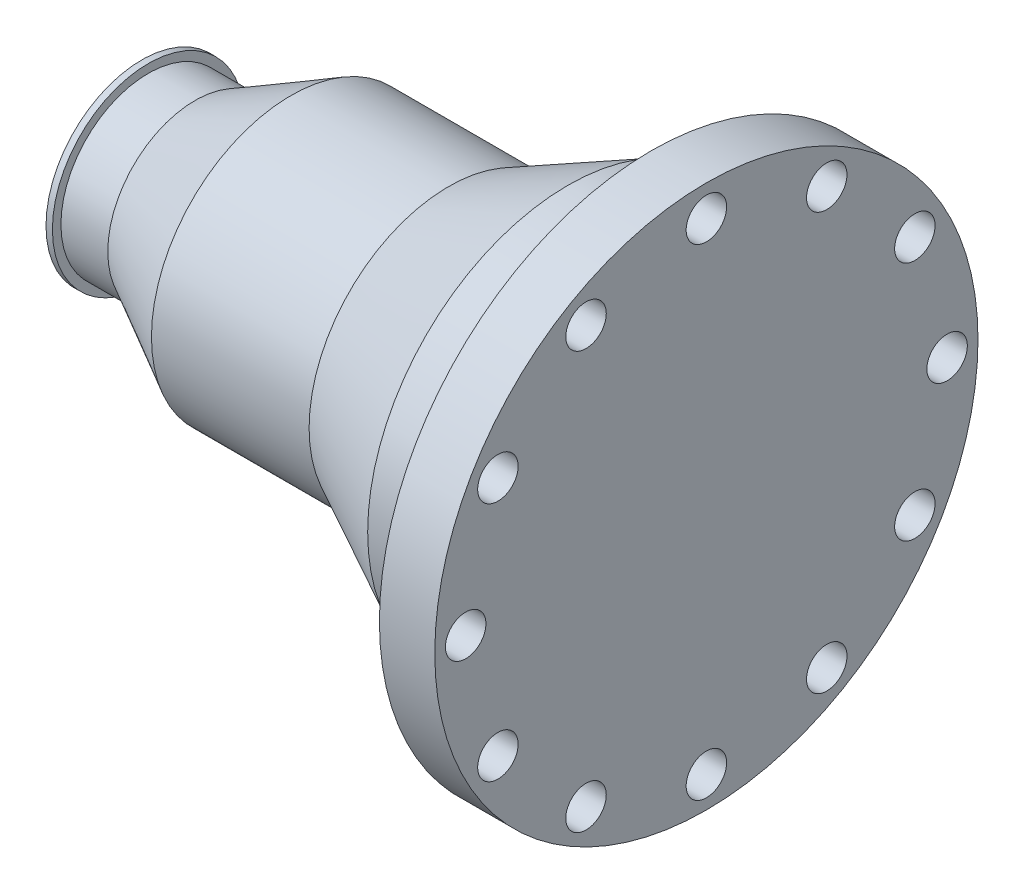
ISO-10303-21;
HEADER;
FILE_DESCRIPTION(('STEP AP214'),'2;1');
FILE_NAME('part.step','',(''),(''),'','','');
FILE_SCHEMA(('AUTOMOTIVE_DESIGN { 1 0 10303 214 1 1 1 1 }'));
ENDSEC;
DATA;
#1=APPLICATION_CONTEXT('core data for automotive mechanical design processes');
#2=APPLICATION_PROTOCOL_DEFINITION('international standard','automotive_design',2000,#1);
#3=PRODUCT_CONTEXT('',#1,'mechanical');
#4=PRODUCT('Part','Part','',(#3));
#5=PRODUCT_RELATED_PRODUCT_CATEGORY('part','',(#4));
#6=PRODUCT_DEFINITION_FORMATION('','',#4);
#7=PRODUCT_DEFINITION_CONTEXT('part definition',#1,'design');
#8=PRODUCT_DEFINITION('design','',#6,#7);
#9=PRODUCT_DEFINITION_SHAPE('','',#8);
#10=(LENGTH_UNIT() NAMED_UNIT(*) SI_UNIT(.MILLI.,.METRE.));
#11=(NAMED_UNIT(*) PLANE_ANGLE_UNIT() SI_UNIT($,.RADIAN.));
#12=(NAMED_UNIT(*) SI_UNIT($,.STERADIAN.) SOLID_ANGLE_UNIT());
#13=UNCERTAINTY_MEASURE_WITH_UNIT(LENGTH_MEASURE(1.E-05),#10,'distance_accuracy_value','');
#14=(GEOMETRIC_REPRESENTATION_CONTEXT(3) GLOBAL_UNCERTAINTY_ASSIGNED_CONTEXT((#13)) GLOBAL_UNIT_ASSIGNED_CONTEXT((#10,
#11,#12)) REPRESENTATION_CONTEXT('',''));
#15=CARTESIAN_POINT('',(0.,0.,0.));
#16=DIRECTION('',(0.,0.,1.));
#17=DIRECTION('',(1.,0.,0.));
#18=AXIS2_PLACEMENT_3D('',#15,#16,#17);
#19=CARTESIAN_POINT('',(0.,0.,0.));
#20=DIRECTION('',(1.,0.,0.));
#21=DIRECTION('',(0.,0.,-1.));
#22=AXIS2_PLACEMENT_3D('',#19,#20,#21);
#23=PLANE('',#22);
#24=CARTESIAN_POINT('',(0.,0.,0.));
#25=DIRECTION('',(-1.,0.,0.));
#26=DIRECTION('',(0.,0.,1.));
#27=AXIS2_PLACEMENT_3D('',#24,#25,#26);
#28=CIRCLE('',#27,31.);
#29=CARTESIAN_POINT('',(0.,0.,31.));
#30=VERTEX_POINT('',#29);
#31=EDGE_CURVE('E80',#30,#30,#28,.T.);
#32=ORIENTED_EDGE('',*,*,#31,.F.);
#33=EDGE_LOOP('',(#32));
#34=FACE_BOUND('',#33,.T.);
#35=CARTESIAN_POINT('',(0.,0.,0.));
#36=DIRECTION('',(-1.,0.,0.));
#37=DIRECTION('',(0.,0.,1.));
#38=AXIS2_PLACEMENT_3D('',#35,#36,#37);
#39=CIRCLE('',#38,45.);
#40=CARTESIAN_POINT('',(0.,0.,45.));
#41=VERTEX_POINT('',#40);
#42=EDGE_CURVE('E10',#41,#41,#39,.T.);
#43=ORIENTED_EDGE('',*,*,#42,.T.);
#44=EDGE_LOOP('',(#43));
#45=FACE_BOUND('',#44,.T.);
#46=ADVANCED_FACE('F37',(#34,#45),#23,.F.);
#47=CARTESIAN_POINT('',(0.,0.,0.));
#48=DIRECTION('',(-1.,0.,0.));
#49=DIRECTION('',(0.,0.,1.));
#50=AXIS2_PLACEMENT_3D('',#47,#48,#49);
#51=CYLINDRICAL_SURFACE('',#50,45.);
#52=ORIENTED_EDGE('',*,*,#42,.F.);
#53=EDGE_LOOP('',(#52));
#54=FACE_BOUND('',#53,.T.);
#55=CARTESIAN_POINT('',(3.,0.,0.));
#56=DIRECTION('',(-1.,0.,0.));
#57=DIRECTION('',(0.,0.,1.));
#58=AXIS2_PLACEMENT_3D('',#55,#56,#57);
#59=CIRCLE('',#58,45.);
#60=CARTESIAN_POINT('',(3.,0.,45.));
#61=VERTEX_POINT('',#60);
#62=EDGE_CURVE('E43',#61,#61,#59,.T.);
#63=ORIENTED_EDGE('',*,*,#62,.T.);
#64=EDGE_LOOP('',(#63));
#65=FACE_BOUND('',#64,.T.);
#66=ADVANCED_FACE('F235',(#54,#65),#51,.T.);
#67=CARTESIAN_POINT('',(3.,45.,0.));
#68=DIRECTION('',(-1.,0.,0.));
#69=DIRECTION('',(0.,0.,1.));
#70=AXIS2_PLACEMENT_3D('',#67,#68,#69);
#71=PLANE('',#70);
#72=ORIENTED_EDGE('',*,*,#62,.F.);
#73=EDGE_LOOP('',(#72));
#74=FACE_BOUND('',#73,.T.);
#75=CARTESIAN_POINT('',(3.,0.,0.));
#76=DIRECTION('',(-1.,0.,0.));
#77=DIRECTION('',(0.,0.,1.));
#78=AXIS2_PLACEMENT_3D('',#75,#76,#77);
#79=CIRCLE('',#78,41.);
#80=CARTESIAN_POINT('',(3.,0.,41.));
#81=VERTEX_POINT('',#80);
#82=EDGE_CURVE('E47',#81,#81,#79,.T.);
#83=ORIENTED_EDGE('',*,*,#82,.T.);
#84=EDGE_LOOP('',(#83));
#85=FACE_BOUND('',#84,.T.);
#86=ADVANCED_FACE('F241',(#74,#85),#71,.F.);
#87=CARTESIAN_POINT('',(0.,0.,0.));
#88=DIRECTION('',(-1.,0.,0.));
#89=DIRECTION('',(0.,0.,1.));
#90=AXIS2_PLACEMENT_3D('',#87,#88,#89);
#91=CYLINDRICAL_SURFACE('',#90,41.);
#92=ORIENTED_EDGE('',*,*,#82,.F.);
#93=EDGE_LOOP('',(#92));
#94=FACE_BOUND('',#93,.T.);
#95=CARTESIAN_POINT('',(25.,0.,0.));
#96=DIRECTION('',(-1.,0.,0.));
#97=DIRECTION('',(0.,0.,1.));
#98=AXIS2_PLACEMENT_3D('',#95,#96,#97);
#99=CIRCLE('',#98,41.);
#100=CARTESIAN_POINT('',(25.,0.,41.));
#101=VERTEX_POINT('',#100);
#102=EDGE_CURVE('E51',#101,#101,#99,.T.);
#103=ORIENTED_EDGE('',*,*,#102,.T.);
#104=EDGE_LOOP('',(#103));
#105=FACE_BOUND('',#104,.T.);
#106=ADVANCED_FACE('F559',(#94,#105),#91,.T.);
#107=CARTESIAN_POINT('',(70.,0.,0.));
#108=DIRECTION('',(1.,0.,0.));
#109=DIRECTION('',(0.,0.,-1.));
#110=AXIS2_PLACEMENT_3D('',#107,#108,#109);
#111=CONICAL_SURFACE('',#110,65.5,0.498567905638218);
#112=ORIENTED_EDGE('',*,*,#102,.F.);
#113=EDGE_LOOP('',(#112));
#114=FACE_BOUND('',#113,.T.);
#115=CARTESIAN_POINT('',(70.,0.,0.));
#116=DIRECTION('',(-1.,0.,0.));
#117=DIRECTION('',(0.,0.,1.));
#118=AXIS2_PLACEMENT_3D('',#115,#116,#117);
#119=CIRCLE('',#118,65.5);
#120=CARTESIAN_POINT('',(70.,0.,65.5));
#121=VERTEX_POINT('',#120);
#122=EDGE_CURVE('E56',#121,#121,#119,.T.);
#123=ORIENTED_EDGE('',*,*,#122,.T.);
#124=EDGE_LOOP('',(#123));
#125=FACE_BOUND('',#124,.T.);
#126=ADVANCED_FACE('F550',(#114,#125),#111,.T.);
#127=CARTESIAN_POINT('',(0.,0.,0.));
#128=DIRECTION('',(-1.,0.,0.));
#129=DIRECTION('',(0.,0.,1.));
#130=AXIS2_PLACEMENT_3D('',#127,#128,#129);
#131=CYLINDRICAL_SURFACE('',#130,65.5);
#132=ORIENTED_EDGE('',*,*,#122,.F.);
#133=EDGE_LOOP('',(#132));
#134=FACE_BOUND('',#133,.T.);
#135=CARTESIAN_POINT('',(144.,0.,0.));
#136=DIRECTION('',(-1.,0.,0.));
#137=DIRECTION('',(0.,0.,1.));
#138=AXIS2_PLACEMENT_3D('',#135,#136,#137);
#139=CIRCLE('',#138,65.5);
#140=CARTESIAN_POINT('',(144.,0.,65.5));
#141=VERTEX_POINT('',#140);
#142=EDGE_CURVE('E59',#141,#141,#139,.T.);
#143=ORIENTED_EDGE('',*,*,#142,.T.);
#144=EDGE_LOOP('',(#143));
#145=FACE_BOUND('',#144,.T.);
#146=ADVANCED_FACE('F541',(#134,#145),#131,.T.);
#147=CARTESIAN_POINT('',(200.,0.,0.));
#148=DIRECTION('',(1.,0.,0.));
#149=DIRECTION('',(0.,0.,-1.));
#150=AXIS2_PLACEMENT_3D('',#147,#148,#149);
#151=CONICAL_SURFACE('',#150,94.,0.470764926542016);
#152=ORIENTED_EDGE('',*,*,#142,.F.);
#153=EDGE_LOOP('',(#152));
#154=FACE_BOUND('',#153,.T.);
#155=CARTESIAN_POINT('',(200.,0.,0.));
#156=DIRECTION('',(-1.,0.,0.));
#157=DIRECTION('',(0.,0.,1.));
#158=AXIS2_PLACEMENT_3D('',#155,#156,#157);
#159=CIRCLE('',#158,94.);
#160=CARTESIAN_POINT('',(200.,0.,94.));
#161=VERTEX_POINT('',#160);
#162=EDGE_CURVE('E62',#161,#161,#159,.T.);
#163=ORIENTED_EDGE('',*,*,#162,.T.);
#164=EDGE_LOOP('',(#163));
#165=FACE_BOUND('',#164,.T.);
#166=ADVANCED_FACE('F532',(#154,#165),#151,.T.);
#167=CARTESIAN_POINT('',(0.,0.,0.));
#168=DIRECTION('',(-1.,0.,0.));
#169=DIRECTION('',(0.,0.,1.));
#170=AXIS2_PLACEMENT_3D('',#167,#168,#169);
#171=CYLINDRICAL_SURFACE('',#170,94.);
#172=ORIENTED_EDGE('',*,*,#162,.F.);
#173=EDGE_LOOP('',(#172));
#174=FACE_BOUND('',#173,.T.);
#175=CARTESIAN_POINT('',(220.,0.,0.));
#176=DIRECTION('',(-1.,0.,0.));
#177=DIRECTION('',(0.,0.,1.));
#178=AXIS2_PLACEMENT_3D('',#175,#176,#177);
#179=CIRCLE('',#178,94.);
#180=CARTESIAN_POINT('',(220.,0.,94.));
#181=VERTEX_POINT('',#180);
#182=EDGE_CURVE('E65',#181,#181,#179,.T.);
#183=ORIENTED_EDGE('',*,*,#182,.T.);
#184=EDGE_LOOP('',(#183));
#185=FACE_BOUND('',#184,.T.);
#186=ADVANCED_FACE('F523',(#174,#185),#171,.T.);
#187=CARTESIAN_POINT('',(220.,94.,0.));
#188=DIRECTION('',(1.,0.,0.));
#189=DIRECTION('',(0.,0.,-1.));
#190=AXIS2_PLACEMENT_3D('',#187,#188,#189);
#191=PLANE('',#190);
#192=ORIENTED_EDGE('',*,*,#182,.F.);
#193=EDGE_LOOP('',(#192));
#194=FACE_BOUND('',#193,.T.);
#195=CARTESIAN_POINT('',(220.,0.,0.));
#196=DIRECTION('',(-1.,0.,0.));
#197=DIRECTION('',(0.,0.,1.));
#198=AXIS2_PLACEMENT_3D('',#195,#196,#197);
#199=CIRCLE('',#198,95.);
#200=CARTESIAN_POINT('',(220.,0.,95.));
#201=VERTEX_POINT('',#200);
#202=EDGE_CURVE('E68',#201,#201,#199,.T.);
#203=ORIENTED_EDGE('',*,*,#202,.T.);
#204=EDGE_LOOP('',(#203));
#205=FACE_BOUND('',#204,.T.);
#206=ADVANCED_FACE('F514',(#194,#205),#191,.F.);
#207=CARTESIAN_POINT('',(0.,0.,0.));
#208=DIRECTION('',(-1.,0.,0.));
#209=DIRECTION('',(0.,0.,1.));
#210=AXIS2_PLACEMENT_3D('',#207,#208,#209);
#211=CYLINDRICAL_SURFACE('',#210,95.);
#212=ORIENTED_EDGE('',*,*,#202,.F.);
#213=EDGE_LOOP('',(#212));
#214=FACE_BOUND('',#213,.T.);
#215=CARTESIAN_POINT('',(239.,0.,0.));
#216=DIRECTION('',(-1.,0.,0.));
#217=DIRECTION('',(0.,0.,1.));
#218=AXIS2_PLACEMENT_3D('',#215,#216,#217);
#219=CIRCLE('',#218,95.);
#220=CARTESIAN_POINT('',(239.,0.,95.));
#221=VERTEX_POINT('',#220);
#222=EDGE_CURVE('E71',#221,#221,#219,.T.);
#223=ORIENTED_EDGE('',*,*,#222,.T.);
#224=EDGE_LOOP('',(#223));
#225=FACE_BOUND('',#224,.T.);
#226=ADVANCED_FACE('F231',(#214,#225),#211,.T.);
#227=CARTESIAN_POINT('',(239.,100.,0.));
#228=DIRECTION('',(1.,0.,0.));
#229=DIRECTION('',(0.,0.,-1.));
#230=AXIS2_PLACEMENT_3D('',#227,#228,#229);
#231=PLANE('',#230);
#232=CARTESIAN_POINT('',(239.,97.8608706276416,-56.5));
#233=DIRECTION('',(1.,0.,0.));
#234=DIRECTION('',(0.,0.,-1.));
#235=AXIS2_PLACEMENT_3D('',#232,#233,#234);
#236=CIRCLE('',#235,9.50000000000001);
#237=CARTESIAN_POINT('',(239.,97.8608706276416,-66.));
#238=VERTEX_POINT('',#237);
#239=EDGE_CURVE('E182',#238,#238,#236,.F.);
#240=ORIENTED_EDGE('',*,*,#239,.F.);
#241=EDGE_LOOP('',(#240));
#242=FACE_BOUND('',#241,.T.);
#243=CARTESIAN_POINT('',(239.,56.4999999999999,-97.8608706276416));
#244=DIRECTION('',(1.,0.,0.));
#245=DIRECTION('',(0.,0.,-1.));
#246=AXIS2_PLACEMENT_3D('',#243,#244,#245);
#247=CIRCLE('',#246,9.5);
#248=CARTESIAN_POINT('',(239.,56.4999999999999,-107.360870627642));
#249=VERTEX_POINT('',#248);
#250=EDGE_CURVE('E176',#249,#249,#247,.F.);
#251=ORIENTED_EDGE('',*,*,#250,.F.);
#252=EDGE_LOOP('',(#251));
#253=FACE_BOUND('',#252,.T.);
#254=CARTESIAN_POINT('',(239.,0.,-113.));
#255=DIRECTION('',(1.,0.,0.));
#256=DIRECTION('',(0.,0.,-1.));
#257=AXIS2_PLACEMENT_3D('',#254,#255,#256);
#258=CIRCLE('',#257,9.49999999999999);
#259=CARTESIAN_POINT('',(239.,0.,-122.5));
#260=VERTEX_POINT('',#259);
#261=EDGE_CURVE('E170',#260,#260,#258,.F.);
#262=ORIENTED_EDGE('',*,*,#261,.F.);
#263=EDGE_LOOP('',(#262));
#264=FACE_BOUND('',#263,.T.);
#265=CARTESIAN_POINT('',(239.,-56.5,-97.8608706276415));
#266=DIRECTION('',(1.,0.,0.));
#267=DIRECTION('',(0.,0.,-1.));
#268=AXIS2_PLACEMENT_3D('',#265,#266,#267);
#269=CIRCLE('',#268,9.5);
#270=CARTESIAN_POINT('',(239.,-56.5,-107.360870627642));
#271=VERTEX_POINT('',#270);
#272=EDGE_CURVE('E164',#271,#271,#269,.F.);
#273=ORIENTED_EDGE('',*,*,#272,.F.);
#274=EDGE_LOOP('',(#273));
#275=FACE_BOUND('',#274,.T.);
#276=CARTESIAN_POINT('',(239.,-97.8608706276416,-56.5));
#277=DIRECTION('',(1.,0.,0.));
#278=DIRECTION('',(0.,0.,-1.));
#279=AXIS2_PLACEMENT_3D('',#276,#277,#278);
#280=CIRCLE('',#279,9.50000000000001);
#281=CARTESIAN_POINT('',(239.,-97.8608706276416,-66.));
#282=VERTEX_POINT('',#281);
#283=EDGE_CURVE('E158',#282,#282,#280,.F.);
#284=ORIENTED_EDGE('',*,*,#283,.F.);
#285=EDGE_LOOP('',(#284));
#286=FACE_BOUND('',#285,.T.);
#287=CARTESIAN_POINT('',(239.,-113.,0.));
#288=DIRECTION('',(1.,0.,0.));
#289=DIRECTION('',(0.,0.,-1.));
#290=AXIS2_PLACEMENT_3D('',#287,#288,#289);
#291=CIRCLE('',#290,9.49999999999998);
#292=CARTESIAN_POINT('',(239.,-113.,-9.49999999999998));
#293=VERTEX_POINT('',#292);
#294=EDGE_CURVE('E152',#293,#293,#291,.F.);
#295=ORIENTED_EDGE('',*,*,#294,.F.);
#296=EDGE_LOOP('',(#295));
#297=FACE_BOUND('',#296,.T.);
#298=CARTESIAN_POINT('',(239.,-97.8608706276415,56.5));
#299=DIRECTION('',(1.,0.,0.));
#300=DIRECTION('',(0.,0.,-1.));
#301=AXIS2_PLACEMENT_3D('',#298,#299,#300);
#302=CIRCLE('',#301,9.5);
#303=CARTESIAN_POINT('',(239.,-97.8608706276415,47.));
#304=VERTEX_POINT('',#303);
#305=EDGE_CURVE('E146',#304,#304,#302,.F.);
#306=ORIENTED_EDGE('',*,*,#305,.F.);
#307=EDGE_LOOP('',(#306));
#308=FACE_BOUND('',#307,.T.);
#309=CARTESIAN_POINT('',(239.,-56.5,97.8608706276416));
#310=DIRECTION('',(1.,0.,0.));
#311=DIRECTION('',(0.,0.,-1.));
#312=AXIS2_PLACEMENT_3D('',#309,#310,#311);
#313=CIRCLE('',#312,9.5);
#314=CARTESIAN_POINT('',(239.,-56.5,88.3608706276416));
#315=VERTEX_POINT('',#314);
#316=EDGE_CURVE('E140',#315,#315,#313,.F.);
#317=ORIENTED_EDGE('',*,*,#316,.F.);
#318=EDGE_LOOP('',(#317));
#319=FACE_BOUND('',#318,.T.);
#320=CARTESIAN_POINT('',(239.,0.,113.));
#321=DIRECTION('',(1.,0.,0.));
#322=DIRECTION('',(0.,0.,-1.));
#323=AXIS2_PLACEMENT_3D('',#320,#321,#322);
#324=CIRCLE('',#323,9.49999999999999);
#325=CARTESIAN_POINT('',(239.,0.,103.5));
#326=VERTEX_POINT('',#325);
#327=EDGE_CURVE('E134',#326,#326,#324,.F.);
#328=ORIENTED_EDGE('',*,*,#327,.F.);
#329=EDGE_LOOP('',(#328));
#330=FACE_BOUND('',#329,.T.);
#331=CARTESIAN_POINT('',(239.,56.5,97.8608706276416));
#332=DIRECTION('',(1.,0.,0.));
#333=DIRECTION('',(0.,0.,-1.));
#334=AXIS2_PLACEMENT_3D('',#331,#332,#333);
#335=CIRCLE('',#334,9.5);
#336=CARTESIAN_POINT('',(239.,56.5,88.3608706276416));
#337=VERTEX_POINT('',#336);
#338=EDGE_CURVE('E128',#337,#337,#335,.F.);
#339=ORIENTED_EDGE('',*,*,#338,.F.);
#340=EDGE_LOOP('',(#339));
#341=FACE_BOUND('',#340,.T.);
#342=CARTESIAN_POINT('',(239.,97.8608706276416,56.5));
#343=DIRECTION('',(1.,0.,0.));
#344=DIRECTION('',(0.,0.,-1.));
#345=AXIS2_PLACEMENT_3D('',#342,#343,#344);
#346=CIRCLE('',#345,9.5);
#347=CARTESIAN_POINT('',(239.,97.8608706276416,47.));
#348=VERTEX_POINT('',#347);
#349=EDGE_CURVE('E122',#348,#348,#346,.F.);
#350=ORIENTED_EDGE('',*,*,#349,.F.);
#351=EDGE_LOOP('',(#350));
#352=FACE_BOUND('',#351,.T.);
#353=CARTESIAN_POINT('',(239.,113.,0.));
#354=DIRECTION('',(1.,0.,0.));
#355=DIRECTION('',(0.,0.,-1.));
#356=AXIS2_PLACEMENT_3D('',#353,#354,#355);
#357=CIRCLE('',#356,9.50000000000001);
#358=CARTESIAN_POINT('',(239.,113.,-9.50000000000001));
#359=VERTEX_POINT('',#358);
#360=EDGE_CURVE('E116',#359,#359,#357,.F.);
#361=ORIENTED_EDGE('',*,*,#360,.F.);
#362=EDGE_LOOP('',(#361));
#363=FACE_BOUND('',#362,.T.);
#364=ORIENTED_EDGE('',*,*,#222,.F.);
#365=EDGE_LOOP('',(#364));
#366=FACE_BOUND('',#365,.T.);
#367=CARTESIAN_POINT('',(239.,0.,0.));
#368=DIRECTION('',(-1.,0.,0.));
#369=DIRECTION('',(0.,0.,1.));
#370=AXIS2_PLACEMENT_3D('',#367,#368,#369);
#371=CIRCLE('',#370,127.5);
#372=CARTESIAN_POINT('',(239.,0.,127.5));
#373=VERTEX_POINT('',#372);
#374=EDGE_CURVE('E74',#373,#373,#371,.T.);
#375=ORIENTED_EDGE('',*,*,#374,.T.);
#376=EDGE_LOOP('',(#375));
#377=FACE_BOUND('',#376,.T.);
#378=ADVANCED_FACE('F223',(#242,#253,#264,#275,#286,#297,#308,#319,#330,#341,#352,#363,#366,
#377),#231,.F.);
#379=CARTESIAN_POINT('',(0.,0.,0.));
#380=DIRECTION('',(-1.,0.,0.));
#381=DIRECTION('',(0.,0.,1.));
#382=AXIS2_PLACEMENT_3D('',#379,#380,#381);
#383=CYLINDRICAL_SURFACE('',#382,127.5);
#384=ORIENTED_EDGE('',*,*,#374,.F.);
#385=EDGE_LOOP('',(#384));
#386=FACE_BOUND('',#385,.T.);
#387=CARTESIAN_POINT('',(265.,0.,0.));
#388=DIRECTION('',(-1.,0.,0.));
#389=DIRECTION('',(0.,0.,1.));
#390=AXIS2_PLACEMENT_3D('',#387,#388,#389);
#391=CIRCLE('',#390,127.5);
#392=CARTESIAN_POINT('',(265.,0.,127.5));
#393=VERTEX_POINT('',#392);
#394=EDGE_CURVE('E77',#393,#393,#391,.T.);
#395=ORIENTED_EDGE('',*,*,#394,.T.);
#396=EDGE_LOOP('',(#395));
#397=FACE_BOUND('',#396,.T.);
#398=ADVANCED_FACE('F196',(#386,#397),#383,.T.);
#399=CARTESIAN_POINT('',(265.,127.5,0.));
#400=DIRECTION('',(-1.,0.,0.));
#401=DIRECTION('',(0.,0.,1.));
#402=AXIS2_PLACEMENT_3D('',#399,#400,#401);
#403=PLANE('',#402);
#404=CARTESIAN_POINT('',(265.,97.8608706276416,-56.5));
#405=DIRECTION('',(1.,0.,0.));
#406=DIRECTION('',(0.,0.,-1.));
#407=AXIS2_PLACEMENT_3D('',#404,#405,#406);
#408=CIRCLE('',#407,9.50000000000001);
#409=CARTESIAN_POINT('',(265.,97.8608706276416,-66.));
#410=VERTEX_POINT('',#409);
#411=EDGE_CURVE('E185',#410,#410,#408,.T.);
#412=ORIENTED_EDGE('',*,*,#411,.F.);
#413=EDGE_LOOP('',(#412));
#414=FACE_BOUND('',#413,.T.);
#415=CARTESIAN_POINT('',(265.,56.4999999999999,-97.8608706276416));
#416=DIRECTION('',(1.,0.,0.));
#417=DIRECTION('',(0.,0.,-1.));
#418=AXIS2_PLACEMENT_3D('',#415,#416,#417);
#419=CIRCLE('',#418,9.5);
#420=CARTESIAN_POINT('',(265.,56.4999999999999,-107.360870627642));
#421=VERTEX_POINT('',#420);
#422=EDGE_CURVE('E179',#421,#421,#419,.T.);
#423=ORIENTED_EDGE('',*,*,#422,.F.);
#424=EDGE_LOOP('',(#423));
#425=FACE_BOUND('',#424,.T.);
#426=CARTESIAN_POINT('',(265.,0.,-113.));
#427=DIRECTION('',(1.,0.,0.));
#428=DIRECTION('',(0.,0.,-1.));
#429=AXIS2_PLACEMENT_3D('',#426,#427,#428);
#430=CIRCLE('',#429,9.49999999999999);
#431=CARTESIAN_POINT('',(265.,0.,-122.5));
#432=VERTEX_POINT('',#431);
#433=EDGE_CURVE('E173',#432,#432,#430,.T.);
#434=ORIENTED_EDGE('',*,*,#433,.F.);
#435=EDGE_LOOP('',(#434));
#436=FACE_BOUND('',#435,.T.);
#437=CARTESIAN_POINT('',(265.,-56.5,-97.8608706276415));
#438=DIRECTION('',(1.,0.,0.));
#439=DIRECTION('',(0.,0.,-1.));
#440=AXIS2_PLACEMENT_3D('',#437,#438,#439);
#441=CIRCLE('',#440,9.5);
#442=CARTESIAN_POINT('',(265.,-56.5,-107.360870627642));
#443=VERTEX_POINT('',#442);
#444=EDGE_CURVE('E167',#443,#443,#441,.T.);
#445=ORIENTED_EDGE('',*,*,#444,.F.);
#446=EDGE_LOOP('',(#445));
#447=FACE_BOUND('',#446,.T.);
#448=CARTESIAN_POINT('',(265.,-97.8608706276416,-56.5));
#449=DIRECTION('',(1.,0.,0.));
#450=DIRECTION('',(0.,0.,-1.));
#451=AXIS2_PLACEMENT_3D('',#448,#449,#450);
#452=CIRCLE('',#451,9.50000000000001);
#453=CARTESIAN_POINT('',(265.,-97.8608706276416,-66.));
#454=VERTEX_POINT('',#453);
#455=EDGE_CURVE('E161',#454,#454,#452,.T.);
#456=ORIENTED_EDGE('',*,*,#455,.F.);
#457=EDGE_LOOP('',(#456));
#458=FACE_BOUND('',#457,.T.);
#459=CARTESIAN_POINT('',(265.,-113.,0.));
#460=DIRECTION('',(1.,0.,0.));
#461=DIRECTION('',(0.,0.,-1.));
#462=AXIS2_PLACEMENT_3D('',#459,#460,#461);
#463=CIRCLE('',#462,9.49999999999998);
#464=CARTESIAN_POINT('',(265.,-113.,-9.49999999999998));
#465=VERTEX_POINT('',#464);
#466=EDGE_CURVE('E155',#465,#465,#463,.T.);
#467=ORIENTED_EDGE('',*,*,#466,.F.);
#468=EDGE_LOOP('',(#467));
#469=FACE_BOUND('',#468,.T.);
#470=CARTESIAN_POINT('',(265.,-97.8608706276415,56.5));
#471=DIRECTION('',(1.,0.,0.));
#472=DIRECTION('',(0.,0.,-1.));
#473=AXIS2_PLACEMENT_3D('',#470,#471,#472);
#474=CIRCLE('',#473,9.5);
#475=CARTESIAN_POINT('',(265.,-97.8608706276415,47.));
#476=VERTEX_POINT('',#475);
#477=EDGE_CURVE('E149',#476,#476,#474,.T.);
#478=ORIENTED_EDGE('',*,*,#477,.F.);
#479=EDGE_LOOP('',(#478));
#480=FACE_BOUND('',#479,.T.);
#481=CARTESIAN_POINT('',(265.,-56.5,97.8608706276416));
#482=DIRECTION('',(1.,0.,0.));
#483=DIRECTION('',(0.,0.,-1.));
#484=AXIS2_PLACEMENT_3D('',#481,#482,#483);
#485=CIRCLE('',#484,9.5);
#486=CARTESIAN_POINT('',(265.,-56.5,88.3608706276416));
#487=VERTEX_POINT('',#486);
#488=EDGE_CURVE('E143',#487,#487,#485,.T.);
#489=ORIENTED_EDGE('',*,*,#488,.F.);
#490=EDGE_LOOP('',(#489));
#491=FACE_BOUND('',#490,.T.);
#492=CARTESIAN_POINT('',(265.,0.,113.));
#493=DIRECTION('',(1.,0.,0.));
#494=DIRECTION('',(0.,0.,-1.));
#495=AXIS2_PLACEMENT_3D('',#492,#493,#494);
#496=CIRCLE('',#495,9.49999999999999);
#497=CARTESIAN_POINT('',(265.,0.,103.5));
#498=VERTEX_POINT('',#497);
#499=EDGE_CURVE('E137',#498,#498,#496,.T.);
#500=ORIENTED_EDGE('',*,*,#499,.F.);
#501=EDGE_LOOP('',(#500));
#502=FACE_BOUND('',#501,.T.);
#503=CARTESIAN_POINT('',(265.,56.5,97.8608706276416));
#504=DIRECTION('',(1.,0.,0.));
#505=DIRECTION('',(0.,0.,-1.));
#506=AXIS2_PLACEMENT_3D('',#503,#504,#505);
#507=CIRCLE('',#506,9.5);
#508=CARTESIAN_POINT('',(265.,56.5,88.3608706276416));
#509=VERTEX_POINT('',#508);
#510=EDGE_CURVE('E131',#509,#509,#507,.T.);
#511=ORIENTED_EDGE('',*,*,#510,.F.);
#512=EDGE_LOOP('',(#511));
#513=FACE_BOUND('',#512,.T.);
#514=CARTESIAN_POINT('',(265.,97.8608706276416,56.5));
#515=DIRECTION('',(1.,0.,0.));
#516=DIRECTION('',(0.,0.,-1.));
#517=AXIS2_PLACEMENT_3D('',#514,#515,#516);
#518=CIRCLE('',#517,9.5);
#519=CARTESIAN_POINT('',(265.,97.8608706276416,47.));
#520=VERTEX_POINT('',#519);
#521=EDGE_CURVE('E125',#520,#520,#518,.T.);
#522=ORIENTED_EDGE('',*,*,#521,.F.);
#523=EDGE_LOOP('',(#522));
#524=FACE_BOUND('',#523,.T.);
#525=CARTESIAN_POINT('',(265.,113.,0.));
#526=DIRECTION('',(1.,0.,0.));
#527=DIRECTION('',(0.,0.,-1.));
#528=AXIS2_PLACEMENT_3D('',#525,#526,#527);
#529=CIRCLE('',#528,9.50000000000001);
#530=CARTESIAN_POINT('',(265.,113.,-9.50000000000001));
#531=VERTEX_POINT('',#530);
#532=EDGE_CURVE('E119',#531,#531,#529,.T.);
#533=ORIENTED_EDGE('',*,*,#532,.F.);
#534=EDGE_LOOP('',(#533));
#535=FACE_BOUND('',#534,.T.);
#536=ORIENTED_EDGE('',*,*,#394,.F.);
#537=EDGE_LOOP('',(#536));
#538=FACE_BOUND('',#537,.T.);
#539=ADVANCED_FACE('F192',(#414,#425,#436,#447,#458,#469,#480,#491,#502,#513,#524,#535,#538),
#403,.F.);
#540=CARTESIAN_POINT('',(0.,0.,0.));
#541=DIRECTION('',(-1.,0.,0.));
#542=DIRECTION('',(0.,0.,1.));
#543=AXIS2_PLACEMENT_3D('',#540,#541,#542);
#544=CYLINDRICAL_SURFACE('',#543,31.);
#545=ORIENTED_EDGE('',*,*,#31,.T.);
#546=EDGE_LOOP('',(#545));
#547=FACE_BOUND('',#546,.T.);
#548=CARTESIAN_POINT('',(42.,0.,0.));
#549=DIRECTION('',(-1.,0.,0.));
#550=DIRECTION('',(0.,0.,1.));
#551=AXIS2_PLACEMENT_3D('',#548,#549,#550);
#552=CIRCLE('',#551,31.);
#553=CARTESIAN_POINT('',(42.,0.,31.));
#554=VERTEX_POINT('',#553);
#555=EDGE_CURVE('E83',#554,#554,#552,.T.);
#556=ORIENTED_EDGE('',*,*,#555,.F.);
#557=EDGE_LOOP('',(#556));
#558=FACE_BOUND('',#557,.T.);
#559=ADVANCED_FACE('F195',(#547,#558),#544,.F.);
#560=CARTESIAN_POINT('',(70.,0.,0.));
#561=DIRECTION('',(1.,0.,0.));
#562=DIRECTION('',(0.,0.,-1.));
#563=AXIS2_PLACEMENT_3D('',#560,#561,#562);
#564=CONICAL_SURFACE('',#563,38.502577,0.261799374867879);
#565=ORIENTED_EDGE('',*,*,#555,.T.);
#566=EDGE_LOOP('',(#565));
#567=FACE_BOUND('',#566,.T.);
#568=CARTESIAN_POINT('',(70.,0.,0.));
#569=DIRECTION('',(-1.,0.,0.));
#570=DIRECTION('',(0.,0.,1.));
#571=AXIS2_PLACEMENT_3D('',#568,#569,#570);
#572=CIRCLE('',#571,38.502577);
#573=CARTESIAN_POINT('',(70.,0.,38.502577));
#574=VERTEX_POINT('',#573);
#575=EDGE_CURVE('E86',#574,#574,#572,.T.);
#576=ORIENTED_EDGE('',*,*,#575,.F.);
#577=EDGE_LOOP('',(#576));
#578=FACE_BOUND('',#577,.T.);
#579=ADVANCED_FACE('F246',(#567,#578),#564,.F.);
#580=CARTESIAN_POINT('',(107.802202951022,0.,0.));
#581=DIRECTION('',(-1.,0.,0.));
#582=DIRECTION('',(0.,0.,1.));
#583=AXIS2_PLACEMENT_3D('',#580,#581,#582);
#584=DEGENERATE_TOROIDAL_SURFACE('',#583,5.77654352226822,49.9999981513586,.T.);
#585=ORIENTED_EDGE('',*,*,#575,.T.);
#586=EDGE_LOOP('',(#585));
#587=FACE_BOUND('',#586,.T.);
#588=CARTESIAN_POINT('',(90.,0.,0.));
#589=DIRECTION('',(-1.,0.,0.));
#590=DIRECTION('',(0.,0.,1.));
#591=AXIS2_PLACEMENT_3D('',#588,#589,#590);
#592=CIRCLE('',#591,52.5);
#593=CARTESIAN_POINT('',(90.,0.,52.5));
#594=VERTEX_POINT('',#593);
#595=EDGE_CURVE('E89',#594,#594,#592,.T.);
#596=ORIENTED_EDGE('',*,*,#595,.F.);
#597=EDGE_LOOP('',(#596));
#598=FACE_BOUND('',#597,.T.);
#599=ADVANCED_FACE('F252',(#587,#598),#584,.F.);
#600=CARTESIAN_POINT('',(0.,0.,0.));
#601=DIRECTION('',(-1.,0.,0.));
#602=DIRECTION('',(0.,0.,1.));
#603=AXIS2_PLACEMENT_3D('',#600,#601,#602);
#604=CYLINDRICAL_SURFACE('',#603,52.5);
#605=ORIENTED_EDGE('',*,*,#595,.T.);
#606=EDGE_LOOP('',(#605));
#607=FACE_BOUND('',#606,.T.);
#608=CARTESIAN_POINT('',(142.,0.,0.));
#609=DIRECTION('',(-1.,0.,0.));
#610=DIRECTION('',(0.,0.,1.));
#611=AXIS2_PLACEMENT_3D('',#608,#609,#610);
#612=CIRCLE('',#611,52.5);
#613=CARTESIAN_POINT('',(142.,0.,52.5));
#614=VERTEX_POINT('',#613);
#615=EDGE_CURVE('E92',#614,#614,#612,.T.);
#616=ORIENTED_EDGE('',*,*,#615,.F.);
#617=EDGE_LOOP('',(#616));
#618=FACE_BOUND('',#617,.T.);
#619=ADVANCED_FACE('F258',(#607,#618),#604,.F.);
#620=CARTESIAN_POINT('',(142.75,0.,0.));
#621=DIRECTION('',(-1.,0.,0.));
#622=DIRECTION('',(0.,0.,1.));
#623=AXIS2_PLACEMENT_3D('',#620,#621,#622);
#624=TOROIDAL_SURFACE('',#623,49.8031848031275,2.79916276877255);
#625=ORIENTED_EDGE('',*,*,#615,.T.);
#626=EDGE_LOOP('',(#625));
#627=FACE_BOUND('',#626,.T.);
#628=CARTESIAN_POINT('',(143.5,0.,0.));
#629=DIRECTION('',(-1.,0.,0.));
#630=DIRECTION('',(0.,0.,1.));
#631=AXIS2_PLACEMENT_3D('',#628,#629,#630);
#632=CIRCLE('',#631,52.5);
#633=CARTESIAN_POINT('',(143.5,0.,52.5));
#634=VERTEX_POINT('',#633);
#635=EDGE_CURVE('E95',#634,#634,#632,.T.);
#636=ORIENTED_EDGE('',*,*,#635,.F.);
#637=EDGE_LOOP('',(#636));
#638=FACE_BOUND('',#637,.T.);
#639=ADVANCED_FACE('F264',(#627,#638),#624,.F.);
#640=CARTESIAN_POINT('',(0.,0.,0.));
#641=DIRECTION('',(-1.,0.,0.));
#642=DIRECTION('',(0.,0.,1.));
#643=AXIS2_PLACEMENT_3D('',#640,#641,#642);
#644=CYLINDRICAL_SURFACE('',#643,52.5);
#645=ORIENTED_EDGE('',*,*,#635,.T.);
#646=EDGE_LOOP('',(#645));
#647=FACE_BOUND('',#646,.T.);
#648=CARTESIAN_POINT('',(146.669872,0.,0.));
#649=DIRECTION('',(-1.,0.,0.));
#650=DIRECTION('',(0.,0.,1.));
#651=AXIS2_PLACEMENT_3D('',#648,#649,#650);
#652=CIRCLE('',#651,52.5);
#653=CARTESIAN_POINT('',(146.669872,0.,52.5));
#654=VERTEX_POINT('',#653);
#655=EDGE_CURVE('E98',#654,#654,#652,.T.);
#656=ORIENTED_EDGE('',*,*,#655,.F.);
#657=EDGE_LOOP('',(#656));
#658=FACE_BOUND('',#657,.T.);
#659=ADVANCED_FACE('F270',(#647,#658),#644,.F.);
#660=CARTESIAN_POINT('',(147.593438045,0.,0.));
#661=DIRECTION('',(-1.,0.,0.));
#662=DIRECTION('',(0.,0.,1.));
#663=AXIS2_PLACEMENT_3D('',#660,#661,#662);
#664=TOROIDAL_SURFACE('',#663,53.580573582,1.42148285448445);
#665=ORIENTED_EDGE('',*,*,#655,.T.);
#666=EDGE_LOOP('',(#665));
#667=FACE_BOUND('',#666,.T.);
#668=CARTESIAN_POINT('',(147.669872,0.,0.));
#669=DIRECTION('',(-1.,0.,0.));
#670=DIRECTION('',(0.,0.,1.));
#671=AXIS2_PLACEMENT_3D('',#668,#669,#670);
#672=CIRCLE('',#671,55.);
#673=CARTESIAN_POINT('',(147.669872,0.,55.));
#674=VERTEX_POINT('',#673);
#675=EDGE_CURVE('E101',#674,#674,#672,.T.);
#676=ORIENTED_EDGE('',*,*,#675,.F.);
#677=EDGE_LOOP('',(#676));
#678=FACE_BOUND('',#677,.T.);
#679=ADVANCED_FACE('F276',(#667,#678),#664,.F.);
#680=CARTESIAN_POINT('',(0.,0.,0.));
#681=DIRECTION('',(-1.,0.,0.));
#682=DIRECTION('',(0.,0.,1.));
#683=AXIS2_PLACEMENT_3D('',#680,#681,#682);
#684=CYLINDRICAL_SURFACE('',#683,55.);
#685=ORIENTED_EDGE('',*,*,#675,.T.);
#686=EDGE_LOOP('',(#685));
#687=FACE_BOUND('',#686,.T.);
#688=CARTESIAN_POINT('',(200.,0.,0.));
#689=DIRECTION('',(-1.,0.,0.));
#690=DIRECTION('',(0.,0.,1.));
#691=AXIS2_PLACEMENT_3D('',#688,#689,#690);
#692=CIRCLE('',#691,55.);
#693=CARTESIAN_POINT('',(200.,0.,55.));
#694=VERTEX_POINT('',#693);
#695=EDGE_CURVE('E104',#694,#694,#692,.T.);
#696=ORIENTED_EDGE('',*,*,#695,.F.);
#697=EDGE_LOOP('',(#696));
#698=FACE_BOUND('',#697,.T.);
#699=ADVANCED_FACE('F282',(#687,#698),#684,.F.);
#700=CARTESIAN_POINT('',(208.,0.,0.));
#701=DIRECTION('',(-1.,0.,0.));
#702=DIRECTION('',(0.,0.,1.));
#703=AXIS2_PLACEMENT_3D('',#700,#701,#702);
#704=CONICAL_SURFACE('',#703,47.,0.78539816339745);
#705=ORIENTED_EDGE('',*,*,#695,.T.);
#706=EDGE_LOOP('',(#705));
#707=FACE_BOUND('',#706,.T.);
#708=CARTESIAN_POINT('',(208.,0.,0.));
#709=DIRECTION('',(-1.,0.,0.));
#710=DIRECTION('',(0.,0.,1.));
#711=AXIS2_PLACEMENT_3D('',#708,#709,#710);
#712=CIRCLE('',#711,47.);
#713=CARTESIAN_POINT('',(208.,0.,47.));
#714=VERTEX_POINT('',#713);
#715=EDGE_CURVE('E107',#714,#714,#712,.T.);
#716=ORIENTED_EDGE('',*,*,#715,.F.);
#717=EDGE_LOOP('',(#716));
#718=FACE_BOUND('',#717,.T.);
#719=ADVANCED_FACE('F288',(#707,#718),#704,.F.);
#720=CARTESIAN_POINT('',(209.,0.,0.));
#721=DIRECTION('',(-1.,0.,0.));
#722=DIRECTION('',(0.,0.,1.));
#723=AXIS2_PLACEMENT_3D('',#720,#721,#722);
#724=TOROIDAL_SURFACE('',#723,43.9726605078742,3.18822590174923);
#725=ORIENTED_EDGE('',*,*,#715,.T.);
#726=EDGE_LOOP('',(#725));
#727=FACE_BOUND('',#726,.T.);
#728=CARTESIAN_POINT('',(210.,0.,0.));
#729=DIRECTION('',(-1.,0.,0.));
#730=DIRECTION('',(0.,0.,1.));
#731=AXIS2_PLACEMENT_3D('',#728,#729,#730);
#732=CIRCLE('',#731,47.);
#733=CARTESIAN_POINT('',(210.,0.,47.));
#734=VERTEX_POINT('',#733);
#735=EDGE_CURVE('E110',#734,#734,#732,.T.);
#736=ORIENTED_EDGE('',*,*,#735,.F.);
#737=EDGE_LOOP('',(#736));
#738=FACE_BOUND('',#737,.T.);
#739=ADVANCED_FACE('F294',(#727,#738),#724,.F.);
#740=CARTESIAN_POINT('',(0.,0.,0.));
#741=DIRECTION('',(-1.,0.,0.));
#742=DIRECTION('',(0.,0.,1.));
#743=AXIS2_PLACEMENT_3D('',#740,#741,#742);
#744=CYLINDRICAL_SURFACE('',#743,47.);
#745=ORIENTED_EDGE('',*,*,#735,.T.);
#746=EDGE_LOOP('',(#745));
#747=FACE_BOUND('',#746,.T.);
#748=CARTESIAN_POINT('',(239.,0.,0.));
#749=DIRECTION('',(-1.,0.,0.));
#750=DIRECTION('',(0.,0.,1.));
#751=AXIS2_PLACEMENT_3D('',#748,#749,#750);
#752=CIRCLE('',#751,47.);
#753=CARTESIAN_POINT('',(239.,0.,47.));
#754=VERTEX_POINT('',#753);
#755=EDGE_CURVE('E113',#754,#754,#752,.T.);
#756=ORIENTED_EDGE('',*,*,#755,.F.);
#757=EDGE_LOOP('',(#756));
#758=FACE_BOUND('',#757,.T.);
#759=ADVANCED_FACE('F300',(#747,#758),#744,.F.);
#760=CARTESIAN_POINT('',(239.,47.,0.));
#761=DIRECTION('',(-1.,0.,0.));
#762=DIRECTION('',(0.,0.,1.));
#763=AXIS2_PLACEMENT_3D('',#760,#761,#762);
#764=PLANE('',#763);
#765=ORIENTED_EDGE('',*,*,#755,.T.);
#766=EDGE_LOOP('',(#765));
#767=FACE_BOUND('',#766,.T.);
#768=ADVANCED_FACE('F306',(#767),#764,.T.);
#769=CARTESIAN_POINT('',(265.,113.,0.));
#770=DIRECTION('',(-1.,0.,0.));
#771=DIRECTION('',(0.,0.,1.));
#772=AXIS2_PLACEMENT_3D('',#769,#770,#771);
#773=CYLINDRICAL_SURFACE('',#772,9.50000000000001);
#774=ORIENTED_EDGE('',*,*,#532,.T.);
#775=EDGE_LOOP('',(#774));
#776=FACE_BOUND('',#775,.T.);
#777=ORIENTED_EDGE('',*,*,#360,.T.);
#778=EDGE_LOOP('',(#777));
#779=FACE_BOUND('',#778,.T.);
#780=ADVANCED_FACE('F311',(#776,#779),#773,.F.);
#781=CARTESIAN_POINT('',(265.,97.8608706276416,56.5));
#782=DIRECTION('',(-1.,0.,0.));
#783=DIRECTION('',(0.,0.,1.));
#784=AXIS2_PLACEMENT_3D('',#781,#782,#783);
#785=CYLINDRICAL_SURFACE('',#784,9.5);
#786=ORIENTED_EDGE('',*,*,#521,.T.);
#787=EDGE_LOOP('',(#786));
#788=FACE_BOUND('',#787,.T.);
#789=ORIENTED_EDGE('',*,*,#349,.T.);
#790=EDGE_LOOP('',(#789));
#791=FACE_BOUND('',#790,.T.);
#792=ADVANCED_FACE('F316',(#788,#791),#785,.F.);
#793=CARTESIAN_POINT('',(265.,56.5,97.8608706276416));
#794=DIRECTION('',(-1.,0.,0.));
#795=DIRECTION('',(0.,0.,1.));
#796=AXIS2_PLACEMENT_3D('',#793,#794,#795);
#797=CYLINDRICAL_SURFACE('',#796,9.5);
#798=ORIENTED_EDGE('',*,*,#510,.T.);
#799=EDGE_LOOP('',(#798));
#800=FACE_BOUND('',#799,.T.);
#801=ORIENTED_EDGE('',*,*,#338,.T.);
#802=EDGE_LOOP('',(#801));
#803=FACE_BOUND('',#802,.T.);
#804=ADVANCED_FACE('F322',(#800,#803),#797,.F.);
#805=CARTESIAN_POINT('',(265.,0.,113.));
#806=DIRECTION('',(-1.,0.,0.));
#807=DIRECTION('',(0.,0.,1.));
#808=AXIS2_PLACEMENT_3D('',#805,#806,#807);
#809=CYLINDRICAL_SURFACE('',#808,9.49999999999999);
#810=ORIENTED_EDGE('',*,*,#499,.T.);
#811=EDGE_LOOP('',(#810));
#812=FACE_BOUND('',#811,.T.);
#813=ORIENTED_EDGE('',*,*,#327,.T.);
#814=EDGE_LOOP('',(#813));
#815=FACE_BOUND('',#814,.T.);
#816=ADVANCED_FACE('F326',(#812,#815),#809,.F.);
#817=CARTESIAN_POINT('',(265.,-56.5,97.8608706276416));
#818=DIRECTION('',(-1.,0.,0.));
#819=DIRECTION('',(0.,0.,1.));
#820=AXIS2_PLACEMENT_3D('',#817,#818,#819);
#821=CYLINDRICAL_SURFACE('',#820,9.5);
#822=ORIENTED_EDGE('',*,*,#488,.T.);
#823=EDGE_LOOP('',(#822));
#824=FACE_BOUND('',#823,.T.);
#825=ORIENTED_EDGE('',*,*,#316,.T.);
#826=EDGE_LOOP('',(#825));
#827=FACE_BOUND('',#826,.T.);
#828=ADVANCED_FACE('F330',(#824,#827),#821,.F.);
#829=CARTESIAN_POINT('',(265.,-97.8608706276415,56.5));
#830=DIRECTION('',(-1.,0.,0.));
#831=DIRECTION('',(0.,0.,1.));
#832=AXIS2_PLACEMENT_3D('',#829,#830,#831);
#833=CYLINDRICAL_SURFACE('',#832,9.5);
#834=ORIENTED_EDGE('',*,*,#477,.T.);
#835=EDGE_LOOP('',(#834));
#836=FACE_BOUND('',#835,.T.);
#837=ORIENTED_EDGE('',*,*,#305,.T.);
#838=EDGE_LOOP('',(#837));
#839=FACE_BOUND('',#838,.T.);
#840=ADVANCED_FACE('F334',(#836,#839),#833,.F.);
#841=CARTESIAN_POINT('',(265.,-113.,0.));
#842=DIRECTION('',(-1.,0.,0.));
#843=DIRECTION('',(0.,0.,1.));
#844=AXIS2_PLACEMENT_3D('',#841,#842,#843);
#845=CYLINDRICAL_SURFACE('',#844,9.49999999999998);
#846=ORIENTED_EDGE('',*,*,#466,.T.);
#847=EDGE_LOOP('',(#846));
#848=FACE_BOUND('',#847,.T.);
#849=ORIENTED_EDGE('',*,*,#294,.T.);
#850=EDGE_LOOP('',(#849));
#851=FACE_BOUND('',#850,.T.);
#852=ADVANCED_FACE('F338',(#848,#851),#845,.F.);
#853=CARTESIAN_POINT('',(265.,-97.8608706276416,-56.5));
#854=DIRECTION('',(-1.,0.,0.));
#855=DIRECTION('',(0.,0.,1.));
#856=AXIS2_PLACEMENT_3D('',#853,#854,#855);
#857=CYLINDRICAL_SURFACE('',#856,9.50000000000001);
#858=ORIENTED_EDGE('',*,*,#455,.T.);
#859=EDGE_LOOP('',(#858));
#860=FACE_BOUND('',#859,.T.);
#861=ORIENTED_EDGE('',*,*,#283,.T.);
#862=EDGE_LOOP('',(#861));
#863=FACE_BOUND('',#862,.T.);
#864=ADVANCED_FACE('F342',(#860,#863),#857,.F.);
#865=CARTESIAN_POINT('',(265.,-56.5,-97.8608706276415));
#866=DIRECTION('',(-1.,0.,0.));
#867=DIRECTION('',(0.,0.,1.));
#868=AXIS2_PLACEMENT_3D('',#865,#866,#867);
#869=CYLINDRICAL_SURFACE('',#868,9.5);
#870=ORIENTED_EDGE('',*,*,#444,.T.);
#871=EDGE_LOOP('',(#870));
#872=FACE_BOUND('',#871,.T.);
#873=ORIENTED_EDGE('',*,*,#272,.T.);
#874=EDGE_LOOP('',(#873));
#875=FACE_BOUND('',#874,.T.);
#876=ADVANCED_FACE('F346',(#872,#875),#869,.F.);
#877=CARTESIAN_POINT('',(265.,0.,-113.));
#878=DIRECTION('',(-1.,0.,0.));
#879=DIRECTION('',(0.,0.,1.));
#880=AXIS2_PLACEMENT_3D('',#877,#878,#879);
#881=CYLINDRICAL_SURFACE('',#880,9.49999999999999);
#882=ORIENTED_EDGE('',*,*,#433,.T.);
#883=EDGE_LOOP('',(#882));
#884=FACE_BOUND('',#883,.T.);
#885=ORIENTED_EDGE('',*,*,#261,.T.);
#886=EDGE_LOOP('',(#885));
#887=FACE_BOUND('',#886,.T.);
#888=ADVANCED_FACE('F350',(#884,#887),#881,.F.);
#889=CARTESIAN_POINT('',(265.,56.4999999999999,-97.8608706276416));
#890=DIRECTION('',(-1.,0.,0.));
#891=DIRECTION('',(0.,0.,1.));
#892=AXIS2_PLACEMENT_3D('',#889,#890,#891);
#893=CYLINDRICAL_SURFACE('',#892,9.5);
#894=ORIENTED_EDGE('',*,*,#422,.T.);
#895=EDGE_LOOP('',(#894));
#896=FACE_BOUND('',#895,.T.);
#897=ORIENTED_EDGE('',*,*,#250,.T.);
#898=EDGE_LOOP('',(#897));
#899=FACE_BOUND('',#898,.T.);
#900=ADVANCED_FACE('F354',(#896,#899),#893,.F.);
#901=CARTESIAN_POINT('',(265.,97.8608706276416,-56.5));
#902=DIRECTION('',(-1.,0.,0.));
#903=DIRECTION('',(0.,0.,1.));
#904=AXIS2_PLACEMENT_3D('',#901,#902,#903);
#905=CYLINDRICAL_SURFACE('',#904,9.50000000000001);
#906=ORIENTED_EDGE('',*,*,#411,.T.);
#907=EDGE_LOOP('',(#906));
#908=FACE_BOUND('',#907,.T.);
#909=ORIENTED_EDGE('',*,*,#239,.T.);
#910=EDGE_LOOP('',(#909));
#911=FACE_BOUND('',#910,.T.);
#912=ADVANCED_FACE('F189',(#908,#911),#905,.F.);
#913=CLOSED_SHELL('',(#46,#66,#86,#106,#126,#146,#166,#186,#206,#226,#378,#398,#539,#559,#579,
#599,#619,#639,#659,#679,#699,#719,#739,#759,#768,#780,#792,#804,#816,#828,#840,#852,#864,#876,
#888,#900,#912));
#914=MANIFOLD_SOLID_BREP('B2',#913);
#915=ADVANCED_BREP_SHAPE_REPRESENTATION('',(#18,#914),#14);
#916=SHAPE_DEFINITION_REPRESENTATION(#9,#915);
ENDSEC;
END-ISO-10303-21;
